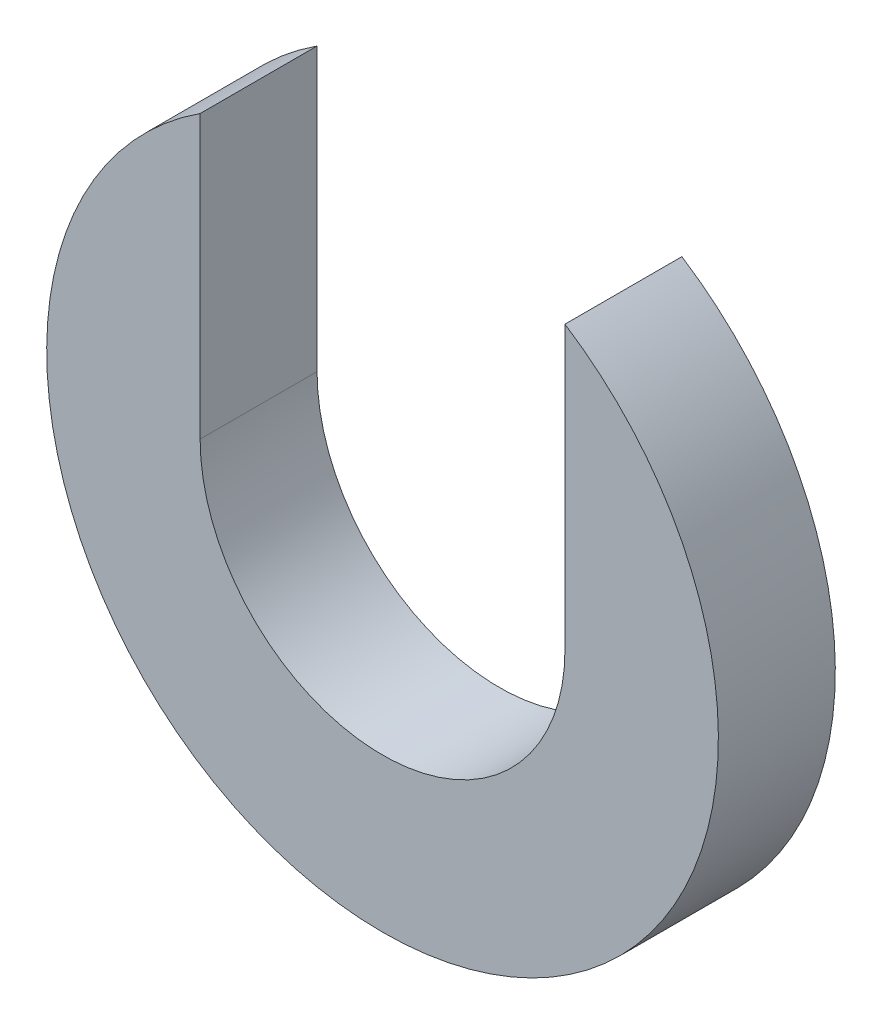
ISO-10303-21;
HEADER;
FILE_DESCRIPTION(('STEP AP214'),'2;1');
FILE_NAME('part.step','',(''),(''),'','','');
FILE_SCHEMA(('AUTOMOTIVE_DESIGN { 1 0 10303 214 1 1 1 1 }'));
ENDSEC;
DATA;
#1=APPLICATION_CONTEXT('core data for automotive mechanical design processes');
#2=APPLICATION_PROTOCOL_DEFINITION('international standard','automotive_design',2000,#1);
#3=PRODUCT_CONTEXT('',#1,'mechanical');
#4=PRODUCT('Part','Part','',(#3));
#5=PRODUCT_RELATED_PRODUCT_CATEGORY('part','',(#4));
#6=PRODUCT_DEFINITION_FORMATION('','',#4);
#7=PRODUCT_DEFINITION_CONTEXT('part definition',#1,'design');
#8=PRODUCT_DEFINITION('design','',#6,#7);
#9=PRODUCT_DEFINITION_SHAPE('','',#8);
#10=(LENGTH_UNIT() NAMED_UNIT(*) SI_UNIT(.MILLI.,.METRE.));
#11=(NAMED_UNIT(*) PLANE_ANGLE_UNIT() SI_UNIT($,.RADIAN.));
#12=(NAMED_UNIT(*) SI_UNIT($,.STERADIAN.) SOLID_ANGLE_UNIT());
#13=UNCERTAINTY_MEASURE_WITH_UNIT(LENGTH_MEASURE(1.E-05),#10,'distance_accuracy_value','');
#14=(GEOMETRIC_REPRESENTATION_CONTEXT(3) GLOBAL_UNCERTAINTY_ASSIGNED_CONTEXT((#13)) GLOBAL_UNIT_ASSIGNED_CONTEXT((#10,
#11,#12)) REPRESENTATION_CONTEXT('',''));
#15=CARTESIAN_POINT('',(0.,0.,0.));
#16=DIRECTION('',(0.,0.,1.));
#17=DIRECTION('',(1.,0.,0.));
#18=AXIS2_PLACEMENT_3D('',#15,#16,#17);
#19=CARTESIAN_POINT('',(0.,0.,3.175));
#20=DIRECTION('',(0.,0.,-1.));
#21=DIRECTION('',(-1.,0.,0.));
#22=AXIS2_PLACEMENT_3D('',#19,#20,#21);
#23=CYLINDRICAL_SURFACE('',#22,9.1186);
#24=CARTESIAN_POINT('',(0.,0.,0.));
#25=DIRECTION('',(0.,0.,1.));
#26=DIRECTION('',(1.,0.,0.));
#27=AXIS2_PLACEMENT_3D('',#24,#25,#26);
#28=CIRCLE('',#27,9.1186);
#29=CARTESIAN_POINT('',(-4.953,7.65615157634696,0.));
#30=VERTEX_POINT('',#29);
#31=CARTESIAN_POINT('',(4.953,7.65615157634696,0.));
#32=VERTEX_POINT('',#31);
#33=EDGE_CURVE('E102',#30,#32,#28,.T.);
#34=ORIENTED_EDGE('',*,*,#33,.T.);
#35=DIRECTION('',(0.,0.,-1.));
#36=VECTOR('',#35,1.);
#37=CARTESIAN_POINT('',(4.953,7.65615157634696,3.175));
#38=LINE('',#37,#36);
#39=CARTESIAN_POINT('',(4.953,7.65615157634696,3.175));
#40=VERTEX_POINT('',#39);
#41=EDGE_CURVE('E11',#40,#32,#38,.T.);
#42=ORIENTED_EDGE('',*,*,#41,.F.);
#43=CARTESIAN_POINT('',(0.,0.,3.175));
#44=DIRECTION('',(0.,0.,1.));
#45=DIRECTION('',(1.,0.,0.));
#46=AXIS2_PLACEMENT_3D('',#43,#44,#45);
#47=CIRCLE('',#46,9.1186);
#48=CARTESIAN_POINT('',(-4.953,7.65615157634696,3.175));
#49=VERTEX_POINT('',#48);
#50=EDGE_CURVE('E90',#49,#40,#47,.T.);
#51=ORIENTED_EDGE('',*,*,#50,.F.);
#52=DIRECTION('',(0.,0.,-1.));
#53=VECTOR('',#52,1.);
#54=CARTESIAN_POINT('',(-4.953,7.65615157634696,3.175));
#55=LINE('',#54,#53);
#56=EDGE_CURVE('E98',#49,#30,#55,.T.);
#57=ORIENTED_EDGE('',*,*,#56,.T.);
#58=EDGE_LOOP('',(#34,#42,#51,#57));
#59=FACE_BOUND('',#58,.T.);
#60=ADVANCED_FACE('F39',(#59),#23,.T.);
#61=CARTESIAN_POINT('',(4.953,7.65615157634696,3.175));
#62=DIRECTION('',(1.,0.,0.));
#63=DIRECTION('',(0.,1.,0.));
#64=AXIS2_PLACEMENT_3D('',#61,#62,#63);
#65=PLANE('',#64);
#66=DIRECTION('',(0.,-1.,0.));
#67=VECTOR('',#66,1.);
#68=CARTESIAN_POINT('',(4.953,7.65615157634696,0.));
#69=LINE('',#68,#67);
#70=CARTESIAN_POINT('',(4.953,0.,0.));
#71=VERTEX_POINT('',#70);
#72=EDGE_CURVE('E94',#32,#71,#69,.T.);
#73=ORIENTED_EDGE('',*,*,#72,.T.);
#74=DIRECTION('',(0.,0.,-1.));
#75=VECTOR('',#74,1.);
#76=CARTESIAN_POINT('',(4.953,0.,3.175));
#77=LINE('',#76,#75);
#78=CARTESIAN_POINT('',(4.953,0.,3.175));
#79=VERTEX_POINT('',#78);
#80=EDGE_CURVE('E47',#79,#71,#77,.T.);
#81=ORIENTED_EDGE('',*,*,#80,.F.);
#82=DIRECTION('',(0.,-1.,0.));
#83=VECTOR('',#82,1.);
#84=CARTESIAN_POINT('',(4.953,7.65615157634696,3.175));
#85=LINE('',#84,#83);
#86=EDGE_CURVE('E85',#40,#79,#85,.T.);
#87=ORIENTED_EDGE('',*,*,#86,.F.);
#88=ORIENTED_EDGE('',*,*,#41,.T.);
#89=EDGE_LOOP('',(#73,#81,#87,#88));
#90=FACE_BOUND('',#89,.T.);
#91=ADVANCED_FACE('F93',(#90),#65,.F.);
#92=CARTESIAN_POINT('',(0.,0.,3.175));
#93=DIRECTION('',(0.,0.,-1.));
#94=DIRECTION('',(-1.,0.,0.));
#95=AXIS2_PLACEMENT_3D('',#92,#93,#94);
#96=CYLINDRICAL_SURFACE('',#95,4.953);
#97=CARTESIAN_POINT('',(0.,0.,0.));
#98=DIRECTION('',(0.,0.,-1.));
#99=DIRECTION('',(1.,0.,0.));
#100=AXIS2_PLACEMENT_3D('',#97,#98,#99);
#101=CIRCLE('',#100,4.953);
#102=CARTESIAN_POINT('',(-4.953,0.,0.));
#103=VERTEX_POINT('',#102);
#104=EDGE_CURVE('E72',#71,#103,#101,.T.);
#105=ORIENTED_EDGE('',*,*,#104,.T.);
#106=DIRECTION('',(0.,0.,-1.));
#107=VECTOR('',#106,1.);
#108=CARTESIAN_POINT('',(-4.953,0.,3.175));
#109=LINE('',#108,#107);
#110=CARTESIAN_POINT('',(-4.953,0.,3.175));
#111=VERTEX_POINT('',#110);
#112=EDGE_CURVE('E95',#111,#103,#109,.T.);
#113=ORIENTED_EDGE('',*,*,#112,.F.);
#114=CARTESIAN_POINT('',(0.,0.,3.175));
#115=DIRECTION('',(0.,0.,-1.));
#116=DIRECTION('',(1.,0.,0.));
#117=AXIS2_PLACEMENT_3D('',#114,#115,#116);
#118=CIRCLE('',#117,4.953);
#119=EDGE_CURVE('E88',#79,#111,#118,.T.);
#120=ORIENTED_EDGE('',*,*,#119,.F.);
#121=ORIENTED_EDGE('',*,*,#80,.T.);
#122=EDGE_LOOP('',(#105,#113,#120,#121));
#123=FACE_BOUND('',#122,.T.);
#124=ADVANCED_FACE('F96',(#123),#96,.F.);
#125=CARTESIAN_POINT('',(-4.953,7.65615157634696,3.175));
#126=DIRECTION('',(-1.,0.,0.));
#127=DIRECTION('',(0.,-1.,0.));
#128=AXIS2_PLACEMENT_3D('',#125,#126,#127);
#129=PLANE('',#128);
#130=DIRECTION('',(0.,1.,0.));
#131=VECTOR('',#130,1.);
#132=CARTESIAN_POINT('',(-4.953,7.65615157634696,0.));
#133=LINE('',#132,#131);
#134=EDGE_CURVE('E78',#103,#30,#133,.T.);
#135=ORIENTED_EDGE('',*,*,#134,.T.);
#136=ORIENTED_EDGE('',*,*,#56,.F.);
#137=DIRECTION('',(0.,1.,0.));
#138=VECTOR('',#137,1.);
#139=CARTESIAN_POINT('',(-4.953,7.65615157634696,3.175));
#140=LINE('',#139,#138);
#141=EDGE_CURVE('E55',#111,#49,#140,.T.);
#142=ORIENTED_EDGE('',*,*,#141,.F.);
#143=ORIENTED_EDGE('',*,*,#112,.T.);
#144=EDGE_LOOP('',(#135,#136,#142,#143));
#145=FACE_BOUND('',#144,.T.);
#146=ADVANCED_FACE('F109',(#145),#129,.F.);
#147=CARTESIAN_POINT('',(0.,0.,3.175));
#148=DIRECTION('',(0.,0.,1.));
#149=DIRECTION('',(1.,0.,0.));
#150=AXIS2_PLACEMENT_3D('',#147,#148,#149);
#151=PLANE('',#150);
#152=ORIENTED_EDGE('',*,*,#50,.T.);
#153=ORIENTED_EDGE('',*,*,#86,.T.);
#154=ORIENTED_EDGE('',*,*,#119,.T.);
#155=ORIENTED_EDGE('',*,*,#141,.T.);
#156=EDGE_LOOP('',(#152,#153,#154,#155));
#157=FACE_BOUND('',#156,.T.);
#158=ADVANCED_FACE('F86',(#157),#151,.T.);
#159=CARTESIAN_POINT('',(0.,0.,0.));
#160=DIRECTION('',(0.,0.,1.));
#161=DIRECTION('',(1.,0.,0.));
#162=AXIS2_PLACEMENT_3D('',#159,#160,#161);
#163=PLANE('',#162);
#164=ORIENTED_EDGE('',*,*,#33,.F.);
#165=ORIENTED_EDGE('',*,*,#134,.F.);
#166=ORIENTED_EDGE('',*,*,#104,.F.);
#167=ORIENTED_EDGE('',*,*,#72,.F.);
#168=EDGE_LOOP('',(#164,#165,#166,#167));
#169=FACE_BOUND('',#168,.T.);
#170=ADVANCED_FACE('F112',(#169),#163,.F.);
#171=CLOSED_SHELL('',(#60,#91,#124,#146,#158,#170));
#172=MANIFOLD_SOLID_BREP('B2',#171);
#173=ADVANCED_BREP_SHAPE_REPRESENTATION('',(#18,#172),#14);
#174=SHAPE_DEFINITION_REPRESENTATION(#9,#173);
ENDSEC;
END-ISO-10303-21;
